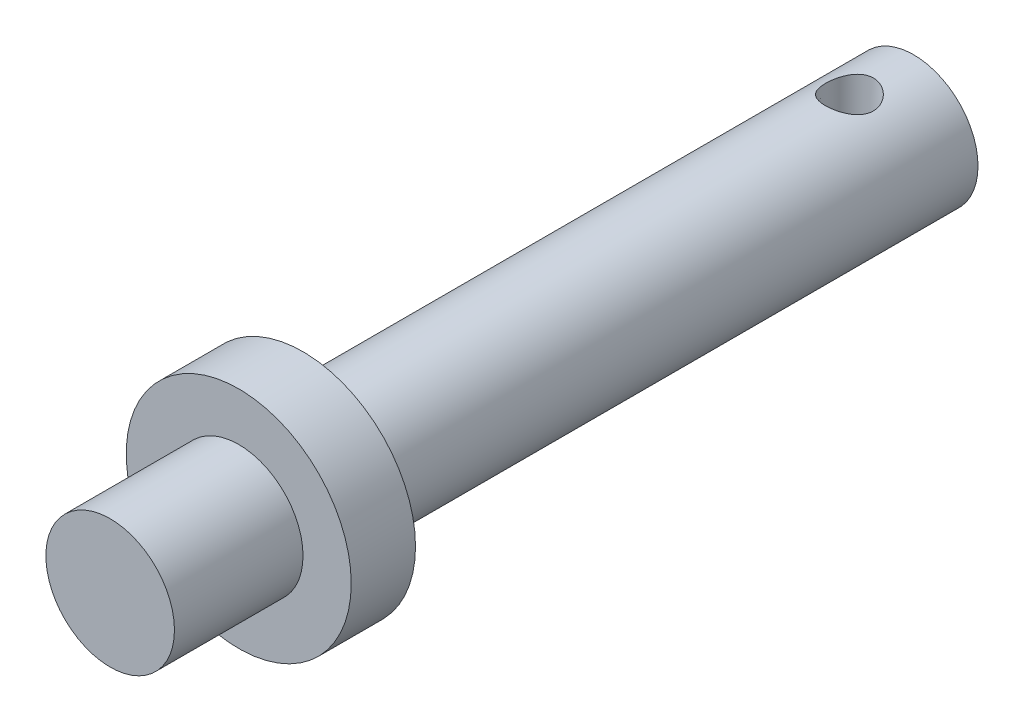
ISO-10303-21;
HEADER;
FILE_DESCRIPTION(('STEP AP214'),'2;1');
FILE_NAME('part.step','',(''),(''),'','','');
FILE_SCHEMA(('AUTOMOTIVE_DESIGN { 1 0 10303 214 1 1 1 1 }'));
ENDSEC;
DATA;
#1=APPLICATION_CONTEXT('core data for automotive mechanical design processes');
#2=APPLICATION_PROTOCOL_DEFINITION('international standard','automotive_design',2000,#1);
#3=PRODUCT_CONTEXT('',#1,'mechanical');
#4=PRODUCT('Part','Part','',(#3));
#5=PRODUCT_RELATED_PRODUCT_CATEGORY('part','',(#4));
#6=PRODUCT_DEFINITION_FORMATION('','',#4);
#7=PRODUCT_DEFINITION_CONTEXT('part definition',#1,'design');
#8=PRODUCT_DEFINITION('design','',#6,#7);
#9=PRODUCT_DEFINITION_SHAPE('','',#8);
#10=(LENGTH_UNIT() NAMED_UNIT(*) SI_UNIT(.MILLI.,.METRE.));
#11=(NAMED_UNIT(*) PLANE_ANGLE_UNIT() SI_UNIT($,.RADIAN.));
#12=(NAMED_UNIT(*) SI_UNIT($,.STERADIAN.) SOLID_ANGLE_UNIT());
#13=UNCERTAINTY_MEASURE_WITH_UNIT(LENGTH_MEASURE(1.E-05),#10,'distance_accuracy_value','');
#14=(GEOMETRIC_REPRESENTATION_CONTEXT(3) GLOBAL_UNCERTAINTY_ASSIGNED_CONTEXT((#13)) GLOBAL_UNIT_ASSIGNED_CONTEXT((#10,
#11,#12)) REPRESENTATION_CONTEXT('',''));
#15=CARTESIAN_POINT('',(0.,0.,0.));
#16=DIRECTION('',(0.,0.,1.));
#17=DIRECTION('',(1.,0.,0.));
#18=AXIS2_PLACEMENT_3D('',#15,#16,#17);
#19=CARTESIAN_POINT('',(0.,0.,50.));
#20=DIRECTION('',(0.,0.,-1.));
#21=DIRECTION('',(-1.,0.,0.));
#22=AXIS2_PLACEMENT_3D('',#19,#20,#21);
#23=CYLINDRICAL_SURFACE('',#22,4.);
#24=CARTESIAN_POINT('',(0.,0.,0.));
#25=DIRECTION('',(0.,0.,1.));
#26=DIRECTION('',(1.,0.,0.));
#27=AXIS2_PLACEMENT_3D('',#24,#25,#26);
#28=CIRCLE('',#27,4.);
#29=CARTESIAN_POINT('',(4.,0.,0.));
#30=VERTEX_POINT('',#29);
#31=EDGE_CURVE('E63',#30,#30,#28,.T.);
#32=ORIENTED_EDGE('',*,*,#31,.T.);
#33=EDGE_LOOP('',(#32));
#34=FACE_BOUND('',#33,.T.);
#35=CARTESIAN_POINT('',(0.,0.,38.));
#36=DIRECTION('',(0.,0.,1.));
#37=DIRECTION('',(1.,0.,0.));
#38=AXIS2_PLACEMENT_3D('',#35,#36,#37);
#39=CIRCLE('',#38,4.);
#40=CARTESIAN_POINT('',(4.,0.,38.));
#41=VERTEX_POINT('',#40);
#42=EDGE_CURVE('E10',#41,#41,#39,.T.);
#43=ORIENTED_EDGE('',*,*,#42,.F.);
#44=EDGE_LOOP('',(#43));
#45=FACE_BOUND('',#44,.T.);
#46=CARTESIAN_POINT('',(-1.1075364336299,3.84361328025933,3.00247248299766));
#47=CARTESIAN_POINT('',(-1.16249828275738,3.82777505959741,3.06374805488562));
#48=CARTESIAN_POINT('',(-1.21248585964115,3.81209100481539,3.12970427370029));
#49=CARTESIAN_POINT('',(-1.30113147672815,3.78275777468566,3.26942718362728));
#50=CARTESIAN_POINT('',(-1.33976095220442,3.76911377150633,3.34321294247509));
#51=CARTESIAN_POINT('',(-1.40443788523997,3.74549684791912,3.49685584950444));
#52=CARTESIAN_POINT('',(-1.43046383237757,3.73553021051772,3.57672311008856));
#53=CARTESIAN_POINT('',(-1.46878995418098,3.72063016093367,3.74007479684379));
#54=CARTESIAN_POINT('',(-1.4811047246703,3.71569139695928,3.82355527809731));
#55=CARTESIAN_POINT('',(-1.49126447980772,3.71162451163722,3.98754375370254));
#56=CARTESIAN_POINT('',(-1.4897685592937,3.71223170246954,4.06800475034012));
#57=CARTESIAN_POINT('',(-1.47393968883231,3.71854439559481,4.22745210504066));
#58=CARTESIAN_POINT('',(-1.45960535738737,3.72425044655853,4.30643830347183));
#59=CARTESIAN_POINT('',(-1.41909111270405,3.73987087910624,4.45909491155968));
#60=CARTESIAN_POINT('',(-1.3931600256361,3.74969660347042,4.53284109554595));
#61=CARTESIAN_POINT('',(-1.33037307230054,3.77242859246144,4.67500901728374));
#62=CARTESIAN_POINT('',(-1.29351452056175,3.78533561417825,4.74342944098232));
#63=CARTESIAN_POINT('',(-1.20751526196822,3.81366796782768,4.87711948197849));
#64=CARTESIAN_POINT('',(-1.15780478120927,3.82919352720728,4.94200131098453));
#65=CARTESIAN_POINT('',(-1.04851065530145,3.86055108444277,5.06277326200136));
#66=CARTESIAN_POINT('',(-0.98892377065344,3.87638318133433,5.11866042183111));
#67=CARTESIAN_POINT('',(-0.858271049782614,3.90743847791372,5.22242514613231));
#68=CARTESIAN_POINT('',(-0.786804499328188,3.92260059030091,5.26981870522818));
#69=CARTESIAN_POINT('',(-0.636329285815448,3.94979994800658,5.35182100712236));
#70=CARTESIAN_POINT('',(-0.557322444130629,3.96183794536189,5.38643282759034));
#71=CARTESIAN_POINT('',(-0.396502386946275,3.98109758186523,5.44074189416179));
#72=CARTESIAN_POINT('',(-0.314849594177442,3.98845563306604,5.46086406876124));
#73=CARTESIAN_POINT('',(-0.149037670567831,3.99808358085052,5.48705262007322));
#74=CARTESIAN_POINT('',(-0.064879578408972,4.00035555712167,5.49312474186284));
#75=CARTESIAN_POINT('',(0.0984519625475337,3.99957534462315,5.49102208823604));
#76=CARTESIAN_POINT('',(0.177638258046817,3.99681686617225,5.48363327406225));
#77=CARTESIAN_POINT('',(0.333544638277461,3.98683468227438,5.4564205667051));
#78=CARTESIAN_POINT('',(0.410264712677869,3.97961095812516,5.43659662143836));
#79=CARTESIAN_POINT('',(0.559121946205254,3.96143994831365,5.38525806991919));
#80=CARTESIAN_POINT('',(0.631262963710233,3.95049584827895,5.35375346332269));
#81=CARTESIAN_POINT('',(0.769349625739991,3.92594271101665,5.28003469256555));
#82=CARTESIAN_POINT('',(0.835293608415072,3.91233296194662,5.2378176668384));
#83=CARTESIAN_POINT('',(0.963000244644676,3.88293173778432,5.1411875112731));
#84=CARTESIAN_POINT('',(1.02433455665753,3.86706150400284,5.08623203750309));
#85=CARTESIAN_POINT('',(1.13717116322558,3.83539868921104,4.96696844115154));
#86=CARTESIAN_POINT('',(1.18867004042633,3.81960613704153,4.90265708146007));
#87=CARTESIAN_POINT('',(1.28230992320633,3.78922175151014,4.76353264972545));
#88=CARTESIAN_POINT('',(1.32401966520122,3.77469858516409,4.68841282909813));
#89=CARTESIAN_POINT('',(1.39410547769541,3.74938246883771,4.53160832936108));
#90=CARTESIAN_POINT('',(1.42248674372735,3.73858806579414,4.44992622284073));
#91=CARTESIAN_POINT('',(1.4639772980098,3.72253287513022,4.28565686244093));
#92=CARTESIAN_POINT('',(1.47763952776123,3.71707251433623,4.2032294278149));
#93=CARTESIAN_POINT('',(1.49102810326135,3.7117236527644,4.03708472907776));
#94=CARTESIAN_POINT('',(1.4907599288668,3.71183296102406,3.95336798510287));
#95=CARTESIAN_POINT('',(1.47673480986016,3.71743188625272,3.79214290149882));
#96=CARTESIAN_POINT('',(1.46375426223903,3.72261181154578,3.71455434334971));
#97=CARTESIAN_POINT('',(1.42594747193554,3.73725574105179,3.56274813707072));
#98=CARTESIAN_POINT('',(1.4011194534408,3.74672038748887,3.48853099610816));
#99=CARTESIAN_POINT('',(1.33986578871651,3.76906300705624,3.34393199333075));
#100=CARTESIAN_POINT('',(1.30323015173287,3.78200201499054,3.27364892040921));
#101=CARTESIAN_POINT('',(1.21953991050796,3.80981141860459,3.14000472866672));
#102=CARTESIAN_POINT('',(1.1724817733626,3.82468246847827,3.07664596787448));
#103=CARTESIAN_POINT('',(1.06568867823638,3.85585165152922,2.95434537750048));
#104=CARTESIAN_POINT('',(1.0053310012707,3.87217990170577,2.89595362712143));
#105=CARTESIAN_POINT('',(0.875466850121882,3.90359012066735,2.78998163704901));
#106=CARTESIAN_POINT('',(0.805959153491027,3.91867192248714,2.74240284429254));
#107=CARTESIAN_POINT('',(0.658546238641211,3.94613733265145,2.65893261020227));
#108=CARTESIAN_POINT('',(0.580547019625334,3.95848490673992,2.62319448686219));
#109=CARTESIAN_POINT('',(0.419061372735104,3.97881835544325,2.56555590763637));
#110=CARTESIAN_POINT('',(0.335577338989108,3.98680611913407,2.54364945793503));
#111=CARTESIAN_POINT('',(0.170352853954391,3.99718132585865,2.51538103673327));
#112=CARTESIAN_POINT('',(0.0887628400501203,3.99984864238307,2.50824146054205));
#113=CARTESIAN_POINT('',(-0.0744713372840173,4.00013859240104,2.50746019176538));
#114=CARTESIAN_POINT('',(-0.15611547264095,3.99776295135497,2.5138138824257));
#115=CARTESIAN_POINT('',(-0.313910599367193,3.98841786816552,2.53924422408641));
#116=CARTESIAN_POINT('',(-0.390152488031206,3.981626069458,2.55782919992445));
#117=CARTESIAN_POINT('',(-0.538437986258681,3.96429865573983,2.60657609978519));
#118=CARTESIAN_POINT('',(-0.610478437715801,3.95376026568454,2.6367466063693));
#119=CARTESIAN_POINT('',(-0.750753355745444,3.9295799662669,2.70881575379837));
#120=CARTESIAN_POINT('',(-0.818798992794655,3.91585149863503,2.75105089075537));
#121=CARTESIAN_POINT('',(-0.946940454699762,3.88685086857623,2.84559003177403));
#122=CARTESIAN_POINT('',(-1.0070535339605,3.87158218847065,2.89787155367807));
#123=CARTESIAN_POINT('',(-1.07790168234898,3.85206227767745,2.97015910882326));
#124=CARTESIAN_POINT('',(-1.09289554460757,3.84783230918036,2.98614972708545));
#125=CARTESIAN_POINT('',(-1.1075364336299,3.84361328025933,3.00247248299766));
#126=B_SPLINE_CURVE_WITH_KNOTS('',3,(#46,#47,#48,#49,#50,#51,#52,#53,#54,#55,#56,#57,#58,#59,
#60,#61,#62,#63,#64,#65,#66,#67,#68,#69,#70,#71,#72,#73,#74,#75,#76,#77,#78,#79,#80,#81,#82,#83,
#84,#85,#86,#87,#88,#89,#90,#91,#92,#93,#94,#95,#96,#97,#98,#99,#100,#101,#102,#103,#104,#105,
#106,#107,#108,#109,#110,#111,#112,#113,#114,#115,#116,#117,#118,#119,#120,#121,#122,#123,#124,
#125),.UNSPECIFIED.,.T.,.F.,(4,2,2,2,2,2,2,2,2,2,2,2,2,2,2,2,2,2,2,2,2,2,2,2,2,2,2,2,2,2,2,2,2,
2,2,2,2,2,2,4),(0.,0.251413823296563,0.503454627894764,0.7559240872635,1.00812453008198,
1.24835369634345,1.48860871595161,1.72393913101958,1.95932742755123,2.20782717327794,
2.45640858978283,2.71637380000333,2.9762763732419,3.22820659527101,3.48003378462578,
3.71762539719328,3.95521800489773,4.19260768068121,4.43006083631778,4.68055080944948,
4.93112765844229,5.19125096450187,5.45127278834981,5.70114375873271,5.9509164371539,
6.18632892224342,6.42177670429952,6.66166703710669,6.90163881008128,7.15711921743753,
7.41263379182472,7.67133816910951,7.92993036239398,8.17451771169893,8.41902138832775,
8.65425192338961,8.88965705446148,9.13240557039664,9.37461705159595,9.44158935955136),.UNSPECIFIED.);
#127=CARTESIAN_POINT('',(-1.1075364336299,3.84361328025933,3.00247248299766));
#128=VERTEX_POINT('',#127);
#129=EDGE_CURVE('E68',#128,#128,#126,.T.);
#130=ORIENTED_EDGE('',*,*,#129,.F.);
#131=EDGE_LOOP('',(#130));
#132=FACE_BOUND('',#131,.T.);
#133=CARTESIAN_POINT('',(-1.05365996287049,-3.85873044959665,3.06266462864552));
#134=CARTESIAN_POINT('',(-1.000938465593,-3.87312584553996,3.00362638550992));
#135=CARTESIAN_POINT('',(-0.94326328890984,-3.88771023221474,2.94905877492601));
#136=CARTESIAN_POINT('',(-0.819413504928859,-3.91568457529647,2.85023544286788));
#137=CARTESIAN_POINT('',(-0.753239883733487,-3.92907466997607,2.80597852668387));
#138=CARTESIAN_POINT('',(-0.613878767222032,-3.95324647222086,2.72896910318812));
#139=CARTESIAN_POINT('',(-0.540678057350046,-3.96402312552438,2.69623883343234));
#140=CARTESIAN_POINT('',(-0.389378961398825,-3.98173007668133,2.64354250415304));
#141=CARTESIAN_POINT('',(-0.311282180657864,-3.98866162801274,2.62357228461428));
#142=CARTESIAN_POINT('',(-0.155464790034678,-3.99771149376684,2.59766199676159));
#143=CARTESIAN_POINT('',(-0.0778347137161209,-3.99999643409902,2.59123591567095));
#144=CARTESIAN_POINT('',(0.0774202105631732,-4.00000355522795,2.5912150729597));
#145=CARTESIAN_POINT('',(0.155045057310585,-3.99772648037349,2.59761821809331));
#146=CARTESIAN_POINT('',(0.305470638676996,-3.98900820313417,2.62258086591686));
#147=CARTESIAN_POINT('',(0.378346217346869,-3.98270363550049,2.64074174414107));
#148=CARTESIAN_POINT('',(0.51997526837773,-3.96670002200767,2.68819602795388));
#149=CARTESIAN_POINT('',(0.588728219514865,-3.95700054798593,2.71749083778417));
#150=CARTESIAN_POINT('',(0.72228647605997,-3.9348461361502,2.78727739422306));
#151=CARTESIAN_POINT('',(0.786929789115346,-3.92232234601422,2.82805668147469));
#152=CARTESIAN_POINT('',(0.908650669010844,-3.89592598174545,2.9193294539211));
#153=CARTESIAN_POINT('',(0.965725678893099,-3.88205295450182,2.9698262081183));
#154=CARTESIAN_POINT('',(1.07366068765564,-3.85363776861148,3.08208928303268));
#155=CARTESIAN_POINT('',(1.12406760411679,-3.83909681454853,3.14429265457584));
#156=CARTESIAN_POINT('',(1.21377651531863,-3.81168647042275,3.27659564390551));
#157=CARTESIAN_POINT('',(1.25307823022119,-3.79881712248685,3.34669546061099));
#158=CARTESIAN_POINT('',(1.31927321159696,-3.77634017209888,3.49288839593376));
#159=CARTESIAN_POINT('',(1.34618826919325,-3.76672684944217,3.5689707115646));
#160=CARTESIAN_POINT('',(1.38665345690515,-3.75202145661339,3.72501748332136));
#161=CARTESIAN_POINT('',(1.40021078867116,-3.74692695032608,3.80497982315373));
#162=CARTESIAN_POINT('',(1.41298728510423,-3.74212619747872,3.96143269098052));
#163=CARTESIAN_POINT('',(1.41300578210472,-3.74211956203163,4.03784943827589));
#164=CARTESIAN_POINT('',(1.40069869950073,-3.74674330827982,4.18953206591067));
#165=CARTESIAN_POINT('',(1.38837400914272,-3.75137335593221,4.26479802876003));
#166=CARTESIAN_POINT('',(1.35231227576142,-3.76451908901724,4.41024742122703));
#167=CARTESIAN_POINT('',(1.32885354191139,-3.77293977150079,4.48050914568777));
#168=CARTESIAN_POINT('',(1.27142442753929,-3.79267682481416,4.6161554934665));
#169=CARTESIAN_POINT('',(1.23745154158988,-3.8039938857134,4.68153894972362));
#170=CARTESIAN_POINT('',(1.15802523509555,-3.82894096856149,4.80905242592927));
#171=CARTESIAN_POINT('',(1.11209045099686,-3.84265721037268,4.87086558377964));
#172=CARTESIAN_POINT('',(1.01084482629303,-3.87052279572069,4.98617108749346));
#173=CARTESIAN_POINT('',(0.955531043021776,-3.88467227404047,5.03966081174299));
#174=CARTESIAN_POINT('',(0.833987599093991,-3.91261126734482,5.13935972762884));
#175=CARTESIAN_POINT('',(0.767366291348472,-3.92635237400947,5.18510687325437));
#176=CARTESIAN_POINT('',(0.626922206317107,-3.95120813598147,5.26473718919682));
#177=CARTESIAN_POINT('',(0.553100572891364,-3.96232320750971,5.29862224004076));
#178=CARTESIAN_POINT('',(0.401889071620213,-3.98047211413548,5.35278132624963));
#179=CARTESIAN_POINT('',(0.324605339584825,-3.98758601832084,5.37332377090485));
#180=CARTESIAN_POINT('',(0.167413025681538,-3.99726951799851,5.40109331147293));
#181=CARTESIAN_POINT('',(0.0875054206937584,-3.99984078562736,5.40832530697974));
#182=CARTESIAN_POINT('',(-0.0683485466881068,-4.00013724725172,5.40916165108153));
#183=CARTESIAN_POINT('',(-0.14429177790682,-3.9980999272612,5.40343383087839));
#184=CARTESIAN_POINT('',(-0.294052752090889,-3.98988192508357,5.37993510592982));
#185=CARTESIAN_POINT('',(-0.367870521777515,-3.98370129500984,5.36216435265695));
#186=CARTESIAN_POINT('',(-0.51106609617699,-3.96786901927889,5.31531545535974));
#187=CARTESIAN_POINT('',(-0.580461152716861,-3.9582319743762,5.28628483443));
#188=CARTESIAN_POINT('',(-0.713474659278975,-3.93643268714016,5.21781207591944));
#189=CARTESIAN_POINT('',(-0.777091717505597,-3.92426983870156,5.17836743871822));
#190=CARTESIAN_POINT('',(-0.899968355938883,-3.89797268644128,5.08801941097474));
#191=CARTESIAN_POINT('',(-0.958881264761479,-3.88377248490248,5.0366635890931));
#192=CARTESIAN_POINT('',(-1.06745254094043,-3.85534705880738,4.92493918969196));
#193=CARTESIAN_POINT('',(-1.1171080829137,-3.84112182794485,4.86456787070091));
#194=CARTESIAN_POINT('',(-1.20737653200993,-3.81373114224093,4.73407134076486));
#195=CARTESIAN_POINT('',(-1.24763462574468,-3.80061652975005,4.66368890688071));
#196=CARTESIAN_POINT('',(-1.31561502097898,-3.77762543317608,4.51661923496432));
#197=CARTESIAN_POINT('',(-1.34334161846008,-3.7677478397149,4.43993416823836));
#198=CARTESIAN_POINT('',(-1.38442712802129,-3.75284242718966,4.28536214549281));
#199=CARTESIAN_POINT('',(-1.39827307158247,-3.74765090139359,4.20762097418538));
#200=CARTESIAN_POINT('',(-1.41274355758372,-3.74222129421335,4.05076124838937));
#201=CARTESIAN_POINT('',(-1.41337356177857,-3.74198116656424,3.97164327642165));
#202=CARTESIAN_POINT('',(-1.40172876042856,-3.74635641933508,3.81887383327976));
#203=CARTESIAN_POINT('',(-1.39015659385249,-3.75070743704091,3.74515973336277));
#204=CARTESIAN_POINT('',(-1.35563585293556,-3.76332103300025,3.60079275963395));
#205=CARTESIAN_POINT('',(-1.33268414962556,-3.77158468706187,3.53014073359734));
#206=CARTESIAN_POINT('',(-1.27408384990541,-3.79179847030956,3.38863751642447));
#207=CARTESIAN_POINT('',(-1.237624853379,-3.80397522306675,3.3181546457066));
#208=CARTESIAN_POINT('',(-1.15363367530657,-3.83028195406753,3.18452655867444));
#209=CARTESIAN_POINT('',(-1.10609700352555,-3.84441272340705,3.12138433342193));
#210=CARTESIAN_POINT('',(-1.05365996287049,-3.85873044959665,3.06266462864552));
#211=B_SPLINE_CURVE_WITH_KNOTS('',3,(#133,#134,#135,#136,#137,#138,#139,#140,#141,#142,#143,
#144,#145,#146,#147,#148,#149,#150,#151,#152,#153,#154,#155,#156,#157,#158,#159,#160,#161,#162,
#163,#164,#165,#166,#167,#168,#169,#170,#171,#172,#173,#174,#175,#176,#177,#178,#179,#180,#181,
#182,#183,#184,#185,#186,#187,#188,#189,#190,#191,#192,#193,#194,#195,#196,#197,#198,#199,#200,
#201,#202,#203,#204,#205,#206,#207,#208,#209,#210),.UNSPECIFIED.,.T.,.F.,(4,2,2,2,2,2,2,2,2,2,2,
2,2,2,2,2,2,2,2,2,2,2,2,2,2,2,2,2,2,2,2,2,2,2,2,2,2,2,4),(0.,0.241076406321081,
0.482124864985213,0.723635846427853,0.965068050540228,1.19767803918481,1.43025007774449,
1.65532310643273,1.88042453136744,2.11175804736689,2.34316952154259,2.58614466529816,
2.82912593119827,3.07167808474441,3.31409939766525,3.54220693758249,3.77029804501522,
3.99296602118279,4.21568709802167,4.44933206371871,4.68305047175726,4.92778594697367,
5.17248260608501,5.41209037292646,5.65160992217808,5.87906941749874,6.10652605195236,
6.33303295602107,6.55959427683032,6.79683332082616,7.03414465295563,7.27933213623621,
7.52443550176158,7.76060153469538,7.9966699653063,8.21985063203904,8.44309269960384,
8.68277106735292,8.92254675605724),.UNSPECIFIED.);
#212=CARTESIAN_POINT('',(-1.05365996287049,-3.85873044959665,3.06266462864552));
#213=VERTEX_POINT('',#212);
#214=EDGE_CURVE('E48',#213,#213,#211,.T.);
#215=ORIENTED_EDGE('',*,*,#214,.F.);
#216=EDGE_LOOP('',(#215));
#217=FACE_BOUND('',#216,.T.);
#218=ADVANCED_FACE('F43',(#34,#45,#132,#217),#23,.T.);
#219=CARTESIAN_POINT('',(0.,0.,0.));
#220=DIRECTION('',(0.,0.,1.));
#221=DIRECTION('',(1.,0.,0.));
#222=AXIS2_PLACEMENT_3D('',#219,#220,#221);
#223=PLANE('',#222);
#224=ORIENTED_EDGE('',*,*,#31,.F.);
#225=EDGE_LOOP('',(#224));
#226=FACE_BOUND('',#225,.T.);
#227=ADVANCED_FACE('F91',(#226),#223,.F.);
#228=CARTESIAN_POINT('',(0.,0.,38.));
#229=DIRECTION('',(0.,0.,1.));
#230=DIRECTION('',(1.,0.,0.));
#231=AXIS2_PLACEMENT_3D('',#228,#229,#230);
#232=CYLINDRICAL_SURFACE('',#231,7.);
#233=CARTESIAN_POINT('',(0.,0.,38.));
#234=DIRECTION('',(0.,0.,1.));
#235=DIRECTION('',(1.,0.,0.));
#236=AXIS2_PLACEMENT_3D('',#233,#234,#235);
#237=CIRCLE('',#236,7.);
#238=CARTESIAN_POINT('',(7.,0.,38.));
#239=VERTEX_POINT('',#238);
#240=EDGE_CURVE('E106',#239,#239,#237,.T.);
#241=ORIENTED_EDGE('',*,*,#240,.T.);
#242=EDGE_LOOP('',(#241));
#243=FACE_BOUND('',#242,.T.);
#244=CARTESIAN_POINT('',(0.,0.,42.));
#245=DIRECTION('',(0.,0.,1.));
#246=DIRECTION('',(1.,0.,0.));
#247=AXIS2_PLACEMENT_3D('',#244,#245,#246);
#248=CIRCLE('',#247,7.);
#249=CARTESIAN_POINT('',(7.,0.,42.));
#250=VERTEX_POINT('',#249);
#251=EDGE_CURVE('E108',#250,#250,#248,.T.);
#252=ORIENTED_EDGE('',*,*,#251,.F.);
#253=EDGE_LOOP('',(#252));
#254=FACE_BOUND('',#253,.T.);
#255=ADVANCED_FACE('F84',(#243,#254),#232,.T.);
#256=CARTESIAN_POINT('',(0.,0.,38.));
#257=DIRECTION('',(0.,0.,1.));
#258=DIRECTION('',(1.,0.,0.));
#259=AXIS2_PLACEMENT_3D('',#256,#257,#258);
#260=PLANE('',#259);
#261=ORIENTED_EDGE('',*,*,#42,.T.);
#262=EDGE_LOOP('',(#261));
#263=FACE_BOUND('',#262,.T.);
#264=ORIENTED_EDGE('',*,*,#240,.F.);
#265=EDGE_LOOP('',(#264));
#266=FACE_BOUND('',#265,.T.);
#267=ADVANCED_FACE('F79',(#263,#266),#260,.F.);
#268=CARTESIAN_POINT('',(0.,0.,42.));
#269=DIRECTION('',(0.,0.,1.));
#270=DIRECTION('',(1.,0.,0.));
#271=AXIS2_PLACEMENT_3D('',#268,#269,#270);
#272=PLANE('',#271);
#273=CARTESIAN_POINT('',(0.,0.,42.));
#274=DIRECTION('',(0.,0.,1.));
#275=DIRECTION('',(1.,0.,0.));
#276=AXIS2_PLACEMENT_3D('',#273,#274,#275);
#277=CIRCLE('',#276,4.);
#278=CARTESIAN_POINT('',(4.,0.,42.));
#279=VERTEX_POINT('',#278);
#280=EDGE_CURVE('E66',#279,#279,#277,.T.);
#281=ORIENTED_EDGE('',*,*,#280,.F.);
#282=EDGE_LOOP('',(#281));
#283=FACE_BOUND('',#282,.T.);
#284=ORIENTED_EDGE('',*,*,#251,.T.);
#285=EDGE_LOOP('',(#284));
#286=FACE_BOUND('',#285,.T.);
#287=ADVANCED_FACE('F83',(#283,#286),#272,.T.);
#288=CARTESIAN_POINT('',(0.,0.,50.));
#289=DIRECTION('',(0.,0.,1.));
#290=DIRECTION('',(1.,0.,0.));
#291=AXIS2_PLACEMENT_3D('',#288,#289,#290);
#292=PLANE('',#291);
#293=CARTESIAN_POINT('',(0.,0.,50.));
#294=DIRECTION('',(0.,0.,1.));
#295=DIRECTION('',(1.,0.,0.));
#296=AXIS2_PLACEMENT_3D('',#293,#294,#295);
#297=CIRCLE('',#296,4.);
#298=CARTESIAN_POINT('',(4.,0.,50.));
#299=VERTEX_POINT('',#298);
#300=EDGE_CURVE('E57',#299,#299,#297,.T.);
#301=ORIENTED_EDGE('',*,*,#300,.T.);
#302=EDGE_LOOP('',(#301));
#303=FACE_BOUND('',#302,.T.);
#304=ADVANCED_FACE('F87',(#303),#292,.T.);
#305=ORIENTED_EDGE('',*,*,#280,.T.);
#306=EDGE_LOOP('',(#305));
#307=FACE_BOUND('',#306,.T.);
#308=ORIENTED_EDGE('',*,*,#300,.F.);
#309=EDGE_LOOP('',(#308));
#310=FACE_BOUND('',#309,.T.);
#311=ADVANCED_FACE('F45',(#307,#310),#23,.T.);
#312=CARTESIAN_POINT('',(0.,-4.84176311995979,4.));
#313=DIRECTION('',(0.,1.,0.));
#314=DIRECTION('',(0.,0.,1.));
#315=AXIS2_PLACEMENT_3D('',#312,#313,#314);
#316=CONICAL_SURFACE('',#315,1.4,0.0104236011428801);
#317=ORIENTED_EDGE('',*,*,#129,.T.);
#318=EDGE_LOOP('',(#317));
#319=FACE_BOUND('',#318,.T.);
#320=ORIENTED_EDGE('',*,*,#214,.T.);
#321=EDGE_LOOP('',(#320));
#322=FACE_BOUND('',#321,.T.);
#323=ADVANCED_FACE('F74',(#319,#322),#316,.F.);
#324=CLOSED_SHELL('',(#218,#227,#255,#267,#287,#304,#311,#323));
#325=MANIFOLD_SOLID_BREP('B2',#324);
#326=ADVANCED_BREP_SHAPE_REPRESENTATION('',(#18,#325),#14);
#327=SHAPE_DEFINITION_REPRESENTATION(#9,#326);
ENDSEC;
END-ISO-10303-21;
